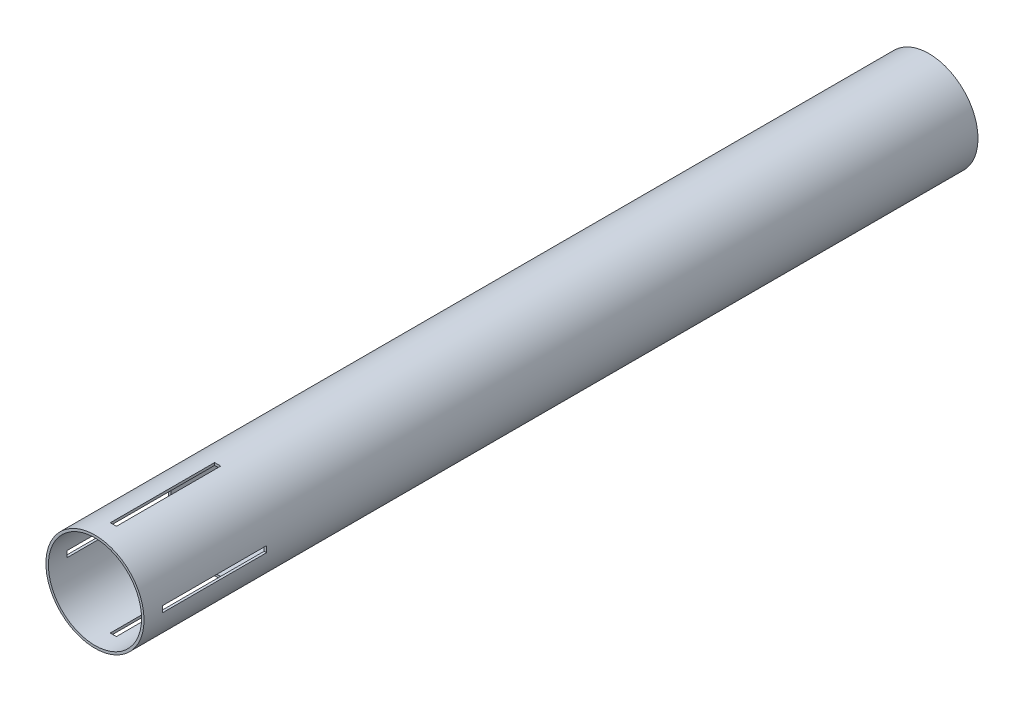
ISO-10303-21;
HEADER;
FILE_DESCRIPTION(('STEP AP214'),'2;1');
FILE_NAME('part.step','',(''),(''),'','','');
FILE_SCHEMA(('AUTOMOTIVE_DESIGN { 1 0 10303 214 1 1 1 1 }'));
ENDSEC;
DATA;
#1=APPLICATION_CONTEXT('core data for automotive mechanical design processes');
#2=APPLICATION_PROTOCOL_DEFINITION('international standard','automotive_design',2000,#1);
#3=PRODUCT_CONTEXT('',#1,'mechanical');
#4=PRODUCT('Part','Part','',(#3));
#5=PRODUCT_RELATED_PRODUCT_CATEGORY('part','',(#4));
#6=PRODUCT_DEFINITION_FORMATION('','',#4);
#7=PRODUCT_DEFINITION_CONTEXT('part definition',#1,'design');
#8=PRODUCT_DEFINITION('design','',#6,#7);
#9=PRODUCT_DEFINITION_SHAPE('','',#8);
#10=(LENGTH_UNIT() NAMED_UNIT(*) SI_UNIT(.MILLI.,.METRE.));
#11=(NAMED_UNIT(*) PLANE_ANGLE_UNIT() SI_UNIT($,.RADIAN.));
#12=(NAMED_UNIT(*) SI_UNIT($,.STERADIAN.) SOLID_ANGLE_UNIT());
#13=UNCERTAINTY_MEASURE_WITH_UNIT(LENGTH_MEASURE(1.E-05),#10,'distance_accuracy_value','');
#14=(GEOMETRIC_REPRESENTATION_CONTEXT(3) GLOBAL_UNCERTAINTY_ASSIGNED_CONTEXT((#13)) GLOBAL_UNIT_ASSIGNED_CONTEXT((#10,
#11,#12)) REPRESENTATION_CONTEXT('',''));
#15=CARTESIAN_POINT('',(0.,0.,0.));
#16=DIRECTION('',(0.,0.,1.));
#17=DIRECTION('',(1.,0.,0.));
#18=AXIS2_PLACEMENT_3D('',#15,#16,#17);
#19=CARTESIAN_POINT('',(-50.7006841669814,-3.175,736.6));
#20=DIRECTION('',(0.,-1.,0.));
#21=DIRECTION('',(0.,0.,-1.));
#22=AXIS2_PLACEMENT_3D('',#19,#20,#21);
#23=PLANE('',#22);
#24=DIRECTION('',(1.,0.,0.));
#25=VECTOR('',#24,1.);
#26=CARTESIAN_POINT('',(-50.7006841669814,-3.175,844.55));
#27=LINE('',#26,#25);
#28=CARTESIAN_POINT('',(-50.7006841669814,-3.175,844.55));
#29=VERTEX_POINT('',#28);
#30=CARTESIAN_POINT('',(-48.1554459537029,-3.175,844.55));
#31=VERTEX_POINT('',#30);
#32=EDGE_CURVE('E56',#29,#31,#27,.T.);
#33=ORIENTED_EDGE('',*,*,#32,.T.);
#34=DIRECTION('',(0.,0.,1.));
#35=VECTOR('',#34,1.);
#36=CARTESIAN_POINT('',(-48.1554459537029,-3.175,736.6));
#37=LINE('',#36,#35);
#38=CARTESIAN_POINT('',(-48.1554459537029,-3.175,736.6));
#39=VERTEX_POINT('',#38);
#40=EDGE_CURVE('E185',#39,#31,#37,.T.);
#41=ORIENTED_EDGE('',*,*,#40,.F.);
#42=DIRECTION('',(1.,0.,0.));
#43=VECTOR('',#42,1.);
#44=CARTESIAN_POINT('',(-50.7006841669814,-3.175,736.6));
#45=LINE('',#44,#43);
#46=CARTESIAN_POINT('',(-50.7006841669814,-3.175,736.6));
#47=VERTEX_POINT('',#46);
#48=EDGE_CURVE('E210',#47,#39,#45,.T.);
#49=ORIENTED_EDGE('',*,*,#48,.F.);
#50=DIRECTION('',(0.,0.,1.));
#51=VECTOR('',#50,1.);
#52=CARTESIAN_POINT('',(-50.7006841669814,-3.175,736.6));
#53=LINE('',#52,#51);
#54=EDGE_CURVE('E51',#47,#29,#53,.T.);
#55=ORIENTED_EDGE('',*,*,#54,.T.);
#56=EDGE_LOOP('',(#33,#41,#49,#55));
#57=FACE_BOUND('',#56,.T.);
#58=ADVANCED_FACE('F36',(#57),#23,.F.);
#59=CARTESIAN_POINT('',(-50.7006841669814,3.175,736.6));
#60=DIRECTION('',(0.,1.,0.));
#61=DIRECTION('',(0.,0.,1.));
#62=AXIS2_PLACEMENT_3D('',#59,#60,#61);
#63=PLANE('',#62);
#64=DIRECTION('',(-1.,0.,0.));
#65=VECTOR('',#64,1.);
#66=CARTESIAN_POINT('',(-48.1554459537029,3.175,844.55));
#67=LINE('',#66,#65);
#68=CARTESIAN_POINT('',(-48.1554459537029,3.175,844.55));
#69=VERTEX_POINT('',#68);
#70=CARTESIAN_POINT('',(-50.7006841669814,3.175,844.55));
#71=VERTEX_POINT('',#70);
#72=EDGE_CURVE('E280',#69,#71,#67,.T.);
#73=ORIENTED_EDGE('',*,*,#72,.T.);
#74=DIRECTION('',(0.,0.,1.));
#75=VECTOR('',#74,1.);
#76=CARTESIAN_POINT('',(-50.7006841669814,3.175,736.6));
#77=LINE('',#76,#75);
#78=CARTESIAN_POINT('',(-50.7006841669814,3.175,736.6));
#79=VERTEX_POINT('',#78);
#80=EDGE_CURVE('E215',#79,#71,#77,.T.);
#81=ORIENTED_EDGE('',*,*,#80,.F.);
#82=DIRECTION('',(-1.,0.,0.));
#83=VECTOR('',#82,1.);
#84=CARTESIAN_POINT('',(-50.7006841669814,3.175,736.6));
#85=LINE('',#84,#83);
#86=CARTESIAN_POINT('',(-48.1554459537029,3.175,736.6));
#87=VERTEX_POINT('',#86);
#88=EDGE_CURVE('E204',#87,#79,#85,.T.);
#89=ORIENTED_EDGE('',*,*,#88,.F.);
#90=DIRECTION('',(0.,0.,1.));
#91=VECTOR('',#90,1.);
#92=CARTESIAN_POINT('',(-48.1554459537029,3.175,736.6));
#93=LINE('',#92,#91);
#94=EDGE_CURVE('E212',#87,#69,#93,.T.);
#95=ORIENTED_EDGE('',*,*,#94,.T.);
#96=EDGE_LOOP('',(#73,#81,#89,#95));
#97=FACE_BOUND('',#96,.T.);
#98=ADVANCED_FACE('F295',(#97),#63,.F.);
#99=CARTESIAN_POINT('',(-3.17500000000001,-48.1554459537029,736.6));
#100=DIRECTION('',(-1.,0.,0.));
#101=DIRECTION('',(0.,-1.,0.));
#102=AXIS2_PLACEMENT_3D('',#99,#100,#101);
#103=PLANE('',#102);
#104=DIRECTION('',(0.,-1.,0.));
#105=VECTOR('',#104,1.);
#106=CARTESIAN_POINT('',(-3.17500000000001,-48.1554459537029,844.55));
#107=LINE('',#106,#105);
#108=CARTESIAN_POINT('',(-3.17500000000001,-48.1554459537029,844.55));
#109=VERTEX_POINT('',#108);
#110=CARTESIAN_POINT('',(-3.17500000000001,-50.7006841669814,844.55));
#111=VERTEX_POINT('',#110);
#112=EDGE_CURVE('E269',#109,#111,#107,.T.);
#113=ORIENTED_EDGE('',*,*,#112,.T.);
#114=DIRECTION('',(0.,0.,1.));
#115=VECTOR('',#114,1.);
#116=CARTESIAN_POINT('',(-3.17500000000001,-50.7006841669814,736.6));
#117=LINE('',#116,#115);
#118=CARTESIAN_POINT('',(-3.17500000000001,-50.7006841669814,736.6));
#119=VERTEX_POINT('',#118);
#120=EDGE_CURVE('E244',#119,#111,#117,.T.);
#121=ORIENTED_EDGE('',*,*,#120,.F.);
#122=DIRECTION('',(0.,-1.,0.));
#123=VECTOR('',#122,1.);
#124=CARTESIAN_POINT('',(-3.17500000000001,-48.1554459537029,736.6));
#125=LINE('',#124,#123);
#126=CARTESIAN_POINT('',(-3.17500000000001,-48.1554459537029,736.6));
#127=VERTEX_POINT('',#126);
#128=EDGE_CURVE('E166',#127,#119,#125,.T.);
#129=ORIENTED_EDGE('',*,*,#128,.F.);
#130=DIRECTION('',(0.,0.,1.));
#131=VECTOR('',#130,1.);
#132=CARTESIAN_POINT('',(-3.17500000000001,-48.1554459537029,736.6));
#133=LINE('',#132,#131);
#134=EDGE_CURVE('E176',#127,#109,#133,.T.);
#135=ORIENTED_EDGE('',*,*,#134,.T.);
#136=EDGE_LOOP('',(#113,#121,#129,#135));
#137=FACE_BOUND('',#136,.T.);
#138=ADVANCED_FACE('F305',(#137),#103,.F.);
#139=CARTESIAN_POINT('',(3.17500000000001,-48.1554459537029,736.6));
#140=DIRECTION('',(1.,0.,0.));
#141=DIRECTION('',(0.,1.,0.));
#142=AXIS2_PLACEMENT_3D('',#139,#140,#141);
#143=PLANE('',#142);
#144=DIRECTION('',(0.,1.,0.));
#145=VECTOR('',#144,1.);
#146=CARTESIAN_POINT('',(3.17500000000001,-50.7006841669814,844.55));
#147=LINE('',#146,#145);
#148=CARTESIAN_POINT('',(3.17500000000001,-50.7006841669814,844.55));
#149=VERTEX_POINT('',#148);
#150=CARTESIAN_POINT('',(3.175,-48.1554459537029,844.55));
#151=VERTEX_POINT('',#150);
#152=EDGE_CURVE('E274',#149,#151,#147,.T.);
#153=ORIENTED_EDGE('',*,*,#152,.T.);
#154=DIRECTION('',(0.,0.,1.));
#155=VECTOR('',#154,1.);
#156=CARTESIAN_POINT('',(3.175,-48.1554459537029,736.6));
#157=LINE('',#156,#155);
#158=CARTESIAN_POINT('',(3.175,-48.1554459537029,736.6));
#159=VERTEX_POINT('',#158);
#160=EDGE_CURVE('E156',#159,#151,#157,.T.);
#161=ORIENTED_EDGE('',*,*,#160,.F.);
#162=DIRECTION('',(0.,1.,0.));
#163=VECTOR('',#162,1.);
#164=CARTESIAN_POINT('',(3.17500000000001,-48.1554459537029,736.6));
#165=LINE('',#164,#163);
#166=CARTESIAN_POINT('',(3.17500000000001,-50.7006841669814,736.6));
#167=VERTEX_POINT('',#166);
#168=EDGE_CURVE('E149',#167,#159,#165,.T.);
#169=ORIENTED_EDGE('',*,*,#168,.F.);
#170=DIRECTION('',(0.,0.,1.));
#171=VECTOR('',#170,1.);
#172=CARTESIAN_POINT('',(3.17500000000001,-50.7006841669814,736.6));
#173=LINE('',#172,#171);
#174=EDGE_CURVE('E153',#167,#149,#173,.T.);
#175=ORIENTED_EDGE('',*,*,#174,.T.);
#176=EDGE_LOOP('',(#153,#161,#169,#175));
#177=FACE_BOUND('',#176,.T.);
#178=ADVANCED_FACE('F151',(#177),#143,.F.);
#179=CARTESIAN_POINT('',(48.1554459537029,-3.175,736.6));
#180=DIRECTION('',(0.,-1.,0.));
#181=DIRECTION('',(0.,0.,-1.));
#182=AXIS2_PLACEMENT_3D('',#179,#180,#181);
#183=PLANE('',#182);
#184=DIRECTION('',(1.,0.,0.));
#185=VECTOR('',#184,1.);
#186=CARTESIAN_POINT('',(48.1554459537029,-3.17500000000002,844.55));
#187=LINE('',#186,#185);
#188=CARTESIAN_POINT('',(48.1554459537029,-3.17500000000002,844.55));
#189=VERTEX_POINT('',#188);
#190=CARTESIAN_POINT('',(50.7006841669814,-3.175,844.55));
#191=VERTEX_POINT('',#190);
#192=EDGE_CURVE('E259',#189,#191,#187,.T.);
#193=ORIENTED_EDGE('',*,*,#192,.T.);
#194=DIRECTION('',(0.,0.,1.));
#195=VECTOR('',#194,1.);
#196=CARTESIAN_POINT('',(50.7006841669814,-3.175,736.6));
#197=LINE('',#196,#195);
#198=CARTESIAN_POINT('',(50.7006841669814,-3.175,736.6));
#199=VERTEX_POINT('',#198);
#200=EDGE_CURVE('E205',#199,#191,#197,.T.);
#201=ORIENTED_EDGE('',*,*,#200,.F.);
#202=DIRECTION('',(1.,0.,0.));
#203=VECTOR('',#202,1.);
#204=CARTESIAN_POINT('',(48.1554459537029,-3.175,736.6));
#205=LINE('',#204,#203);
#206=CARTESIAN_POINT('',(48.1554459537029,-3.17500000000002,736.6));
#207=VERTEX_POINT('',#206);
#208=EDGE_CURVE('E227',#207,#199,#205,.T.);
#209=ORIENTED_EDGE('',*,*,#208,.F.);
#210=DIRECTION('',(0.,0.,1.));
#211=VECTOR('',#210,1.);
#212=CARTESIAN_POINT('',(48.1554459537029,-3.17500000000002,736.6));
#213=LINE('',#212,#211);
#214=EDGE_CURVE('E233',#207,#189,#213,.T.);
#215=ORIENTED_EDGE('',*,*,#214,.T.);
#216=EDGE_LOOP('',(#193,#201,#209,#215));
#217=FACE_BOUND('',#216,.T.);
#218=ADVANCED_FACE('F314',(#217),#183,.F.);
#219=CARTESIAN_POINT('',(48.1554459537029,3.175,736.6));
#220=DIRECTION('',(0.,1.,0.));
#221=DIRECTION('',(0.,0.,1.));
#222=AXIS2_PLACEMENT_3D('',#219,#220,#221);
#223=PLANE('',#222);
#224=DIRECTION('',(-1.,0.,0.));
#225=VECTOR('',#224,1.);
#226=CARTESIAN_POINT('',(50.7006841669814,3.175,844.55));
#227=LINE('',#226,#225);
#228=CARTESIAN_POINT('',(50.7006841669814,3.175,844.55));
#229=VERTEX_POINT('',#228);
#230=CARTESIAN_POINT('',(48.1554459537029,3.175,844.55));
#231=VERTEX_POINT('',#230);
#232=EDGE_CURVE('E264',#229,#231,#227,.T.);
#233=ORIENTED_EDGE('',*,*,#232,.T.);
#234=DIRECTION('',(0.,0.,1.));
#235=VECTOR('',#234,1.);
#236=CARTESIAN_POINT('',(48.1554459537029,3.175,736.6));
#237=LINE('',#236,#235);
#238=CARTESIAN_POINT('',(48.1554459537029,3.175,736.6));
#239=VERTEX_POINT('',#238);
#240=EDGE_CURVE('E235',#239,#231,#237,.T.);
#241=ORIENTED_EDGE('',*,*,#240,.F.);
#242=DIRECTION('',(-1.,0.,0.));
#243=VECTOR('',#242,1.);
#244=CARTESIAN_POINT('',(48.1554459537029,3.175,736.6));
#245=LINE('',#244,#243);
#246=CARTESIAN_POINT('',(50.7006841669814,3.175,736.6));
#247=VERTEX_POINT('',#246);
#248=EDGE_CURVE('E222',#247,#239,#245,.T.);
#249=ORIENTED_EDGE('',*,*,#248,.F.);
#250=DIRECTION('',(0.,0.,1.));
#251=VECTOR('',#250,1.);
#252=CARTESIAN_POINT('',(50.7006841669814,3.175,736.6));
#253=LINE('',#252,#251);
#254=EDGE_CURVE('E230',#247,#229,#253,.T.);
#255=ORIENTED_EDGE('',*,*,#254,.T.);
#256=EDGE_LOOP('',(#233,#241,#249,#255));
#257=FACE_BOUND('',#256,.T.);
#258=ADVANCED_FACE('F317',(#257),#223,.F.);
#259=CARTESIAN_POINT('',(3.175,50.7006841669814,736.6));
#260=DIRECTION('',(1.,0.,0.));
#261=DIRECTION('',(0.,1.,0.));
#262=AXIS2_PLACEMENT_3D('',#259,#260,#261);
#263=PLANE('',#262);
#264=DIRECTION('',(0.,1.,0.));
#265=VECTOR('',#264,1.);
#266=CARTESIAN_POINT('',(3.175,48.1554459537029,844.55));
#267=LINE('',#266,#265);
#268=CARTESIAN_POINT('',(3.175,48.1554459537029,844.55));
#269=VERTEX_POINT('',#268);
#270=CARTESIAN_POINT('',(3.175,50.7006841669814,844.55));
#271=VERTEX_POINT('',#270);
#272=EDGE_CURVE('E223',#269,#271,#267,.T.);
#273=ORIENTED_EDGE('',*,*,#272,.T.);
#274=DIRECTION('',(0.,0.,1.));
#275=VECTOR('',#274,1.);
#276=CARTESIAN_POINT('',(3.175,50.7006841669814,736.6));
#277=LINE('',#276,#275);
#278=CARTESIAN_POINT('',(3.175,50.7006841669814,736.6));
#279=VERTEX_POINT('',#278);
#280=EDGE_CURVE('E169',#279,#271,#277,.T.);
#281=ORIENTED_EDGE('',*,*,#280,.F.);
#282=DIRECTION('',(0.,1.,0.));
#283=VECTOR('',#282,1.);
#284=CARTESIAN_POINT('',(3.175,50.7006841669814,736.6));
#285=LINE('',#284,#283);
#286=CARTESIAN_POINT('',(3.175,48.1554459537029,736.6));
#287=VERTEX_POINT('',#286);
#288=EDGE_CURVE('E189',#287,#279,#285,.T.);
#289=ORIENTED_EDGE('',*,*,#288,.F.);
#290=DIRECTION('',(0.,0.,1.));
#291=VECTOR('',#290,1.);
#292=CARTESIAN_POINT('',(3.175,48.1554459537029,736.6));
#293=LINE('',#292,#291);
#294=EDGE_CURVE('E195',#287,#269,#293,.T.);
#295=ORIENTED_EDGE('',*,*,#294,.T.);
#296=EDGE_LOOP('',(#273,#281,#289,#295));
#297=FACE_BOUND('',#296,.T.);
#298=ADVANCED_FACE('F321',(#297),#263,.F.);
#299=CARTESIAN_POINT('',(-3.175,50.7006841669814,736.6));
#300=DIRECTION('',(-1.,0.,0.));
#301=DIRECTION('',(0.,-1.,0.));
#302=AXIS2_PLACEMENT_3D('',#299,#300,#301);
#303=PLANE('',#302);
#304=DIRECTION('',(0.,-1.,0.));
#305=VECTOR('',#304,1.);
#306=CARTESIAN_POINT('',(-3.175,50.7006841669814,844.55));
#307=LINE('',#306,#305);
#308=CARTESIAN_POINT('',(-3.175,50.7006841669814,844.55));
#309=VERTEX_POINT('',#308);
#310=CARTESIAN_POINT('',(-3.175,48.1554459537029,844.55));
#311=VERTEX_POINT('',#310);
#312=EDGE_CURVE('E254',#309,#311,#307,.T.);
#313=ORIENTED_EDGE('',*,*,#312,.T.);
#314=DIRECTION('',(0.,0.,1.));
#315=VECTOR('',#314,1.);
#316=CARTESIAN_POINT('',(-3.175,48.1554459537029,736.6));
#317=LINE('',#316,#315);
#318=CARTESIAN_POINT('',(-3.175,48.1554459537029,736.6));
#319=VERTEX_POINT('',#318);
#320=EDGE_CURVE('E197',#319,#311,#317,.T.);
#321=ORIENTED_EDGE('',*,*,#320,.F.);
#322=DIRECTION('',(0.,-1.,0.));
#323=VECTOR('',#322,1.);
#324=CARTESIAN_POINT('',(-3.175,50.7006841669814,736.6));
#325=LINE('',#324,#323);
#326=CARTESIAN_POINT('',(-3.175,50.7006841669814,736.6));
#327=VERTEX_POINT('',#326);
#328=EDGE_CURVE('E184',#327,#319,#325,.T.);
#329=ORIENTED_EDGE('',*,*,#328,.F.);
#330=DIRECTION('',(0.,0.,1.));
#331=VECTOR('',#330,1.);
#332=CARTESIAN_POINT('',(-3.175,50.7006841669814,736.6));
#333=LINE('',#332,#331);
#334=EDGE_CURVE('E192',#327,#309,#333,.T.);
#335=ORIENTED_EDGE('',*,*,#334,.T.);
#336=EDGE_LOOP('',(#313,#321,#329,#335));
#337=FACE_BOUND('',#336,.T.);
#338=ADVANCED_FACE('F329',(#337),#303,.F.);
#339=CARTESIAN_POINT('',(0.,0.,863.6));
#340=DIRECTION('',(0.,0.,1.));
#341=DIRECTION('',(1.,0.,0.));
#342=AXIS2_PLACEMENT_3D('',#339,#340,#341);
#343=PLANE('',#342);
#344=CARTESIAN_POINT('',(0.,0.,863.6));
#345=DIRECTION('',(0.,0.,1.));
#346=DIRECTION('',(1.,0.,0.));
#347=AXIS2_PLACEMENT_3D('',#344,#345,#346);
#348=CIRCLE('',#347,48.26);
#349=CARTESIAN_POINT('',(48.26,0.,863.6));
#350=VERTEX_POINT('',#349);
#351=EDGE_CURVE('E239',#350,#350,#348,.T.);
#352=ORIENTED_EDGE('',*,*,#351,.F.);
#353=EDGE_LOOP('',(#352));
#354=FACE_BOUND('',#353,.T.);
#355=CARTESIAN_POINT('',(0.,0.,863.6));
#356=DIRECTION('',(0.,0.,1.));
#357=DIRECTION('',(1.,0.,0.));
#358=AXIS2_PLACEMENT_3D('',#355,#356,#357);
#359=CIRCLE('',#358,50.8);
#360=CARTESIAN_POINT('',(50.8,0.,863.6));
#361=VERTEX_POINT('',#360);
#362=EDGE_CURVE('E11',#361,#361,#359,.T.);
#363=ORIENTED_EDGE('',*,*,#362,.T.);
#364=EDGE_LOOP('',(#363));
#365=FACE_BOUND('',#364,.T.);
#366=ADVANCED_FACE('F326',(#354,#365),#343,.T.);
#367=CARTESIAN_POINT('',(0.,0.,0.));
#368=DIRECTION('',(0.,0.,1.));
#369=DIRECTION('',(1.,0.,0.));
#370=AXIS2_PLACEMENT_3D('',#367,#368,#369);
#371=PLANE('',#370);
#372=CARTESIAN_POINT('',(0.,0.,0.));
#373=DIRECTION('',(0.,0.,1.));
#374=DIRECTION('',(1.,0.,0.));
#375=AXIS2_PLACEMENT_3D('',#372,#373,#374);
#376=CIRCLE('',#375,50.8);
#377=CARTESIAN_POINT('',(50.8,0.,0.));
#378=VERTEX_POINT('',#377);
#379=EDGE_CURVE('E40',#378,#378,#376,.T.);
#380=ORIENTED_EDGE('',*,*,#379,.F.);
#381=EDGE_LOOP('',(#380));
#382=FACE_BOUND('',#381,.T.);
#383=CARTESIAN_POINT('',(0.,0.,0.));
#384=DIRECTION('',(0.,0.,1.));
#385=DIRECTION('',(1.,0.,0.));
#386=AXIS2_PLACEMENT_3D('',#383,#384,#385);
#387=CIRCLE('',#386,48.26);
#388=CARTESIAN_POINT('',(48.26,0.,0.));
#389=VERTEX_POINT('',#388);
#390=EDGE_CURVE('E242',#389,#389,#387,.T.);
#391=ORIENTED_EDGE('',*,*,#390,.T.);
#392=EDGE_LOOP('',(#391));
#393=FACE_BOUND('',#392,.T.);
#394=ADVANCED_FACE('F328',(#382,#393),#371,.F.);
#395=CARTESIAN_POINT('',(0.,0.,863.6));
#396=DIRECTION('',(0.,0.,-1.));
#397=DIRECTION('',(-1.,0.,0.));
#398=AXIS2_PLACEMENT_3D('',#395,#396,#397);
#399=CYLINDRICAL_SURFACE('',#398,50.8);
#400=ORIENTED_EDGE('',*,*,#362,.F.);
#401=EDGE_LOOP('',(#400));
#402=FACE_BOUND('',#401,.T.);
#403=CARTESIAN_POINT('',(0.,0.,844.55));
#404=DIRECTION('',(0.,0.,1.));
#405=DIRECTION('',(1.,0.,0.));
#406=AXIS2_PLACEMENT_3D('',#403,#404,#405);
#407=CIRCLE('',#406,50.8);
#408=EDGE_CURVE('E278',#71,#29,#407,.T.);
#409=ORIENTED_EDGE('',*,*,#408,.T.);
#410=ORIENTED_EDGE('',*,*,#54,.F.);
#411=CARTESIAN_POINT('',(0.,0.,736.6));
#412=DIRECTION('',(0.,0.,1.));
#413=DIRECTION('',(1.,0.,0.));
#414=AXIS2_PLACEMENT_3D('',#411,#412,#413);
#415=CIRCLE('',#414,50.8);
#416=EDGE_CURVE('E208',#79,#47,#415,.T.);
#417=ORIENTED_EDGE('',*,*,#416,.F.);
#418=ORIENTED_EDGE('',*,*,#80,.T.);
#419=EDGE_LOOP('',(#409,#410,#417,#418));
#420=FACE_BOUND('',#419,.T.);
#421=ORIENTED_EDGE('',*,*,#120,.T.);
#422=CARTESIAN_POINT('',(0.,0.,844.55));
#423=DIRECTION('',(0.,0.,1.));
#424=DIRECTION('',(1.,0.,0.));
#425=AXIS2_PLACEMENT_3D('',#422,#423,#424);
#426=CIRCLE('',#425,50.8);
#427=EDGE_CURVE('E174',#111,#149,#426,.T.);
#428=ORIENTED_EDGE('',*,*,#427,.T.);
#429=ORIENTED_EDGE('',*,*,#174,.F.);
#430=CARTESIAN_POINT('',(0.,0.,736.6));
#431=DIRECTION('',(0.,0.,1.));
#432=DIRECTION('',(1.,0.,0.));
#433=AXIS2_PLACEMENT_3D('',#430,#431,#432);
#434=CIRCLE('',#433,50.8);
#435=EDGE_CURVE('E160',#119,#167,#434,.T.);
#436=ORIENTED_EDGE('',*,*,#435,.F.);
#437=EDGE_LOOP('',(#421,#428,#429,#436));
#438=FACE_BOUND('',#437,.T.);
#439=ORIENTED_EDGE('',*,*,#200,.T.);
#440=CARTESIAN_POINT('',(0.,0.,844.55));
#441=DIRECTION('',(0.,0.,1.));
#442=DIRECTION('',(1.,0.,0.));
#443=AXIS2_PLACEMENT_3D('',#440,#441,#442);
#444=CIRCLE('',#443,50.8);
#445=EDGE_CURVE('E266',#191,#229,#444,.T.);
#446=ORIENTED_EDGE('',*,*,#445,.T.);
#447=ORIENTED_EDGE('',*,*,#254,.F.);
#448=CARTESIAN_POINT('',(0.,0.,736.6));
#449=DIRECTION('',(0.,0.,1.));
#450=DIRECTION('',(1.,0.,0.));
#451=AXIS2_PLACEMENT_3D('',#448,#449,#450);
#452=CIRCLE('',#451,50.8);
#453=EDGE_CURVE('E219',#199,#247,#452,.T.);
#454=ORIENTED_EDGE('',*,*,#453,.F.);
#455=EDGE_LOOP('',(#439,#446,#447,#454));
#456=FACE_BOUND('',#455,.T.);
#457=ORIENTED_EDGE('',*,*,#280,.T.);
#458=CARTESIAN_POINT('',(0.,0.,844.55));
#459=DIRECTION('',(0.,0.,1.));
#460=DIRECTION('',(1.,0.,0.));
#461=AXIS2_PLACEMENT_3D('',#458,#459,#460);
#462=CIRCLE('',#461,50.8);
#463=EDGE_CURVE('E256',#271,#309,#462,.T.);
#464=ORIENTED_EDGE('',*,*,#463,.T.);
#465=ORIENTED_EDGE('',*,*,#334,.F.);
#466=CARTESIAN_POINT('',(0.,0.,736.6));
#467=DIRECTION('',(0.,0.,1.));
#468=DIRECTION('',(1.,0.,0.));
#469=AXIS2_PLACEMENT_3D('',#466,#467,#468);
#470=CIRCLE('',#469,50.8);
#471=EDGE_CURVE('E181',#279,#327,#470,.T.);
#472=ORIENTED_EDGE('',*,*,#471,.F.);
#473=EDGE_LOOP('',(#457,#464,#465,#472));
#474=FACE_BOUND('',#473,.T.);
#475=ORIENTED_EDGE('',*,*,#379,.T.);
#476=EDGE_LOOP('',(#475));
#477=FACE_BOUND('',#476,.T.);
#478=ADVANCED_FACE('F38',(#402,#420,#438,#456,#474,#477),#399,.T.);
#479=CARTESIAN_POINT('',(0.,0.,863.6));
#480=DIRECTION('',(0.,0.,-1.));
#481=DIRECTION('',(-1.,0.,0.));
#482=AXIS2_PLACEMENT_3D('',#479,#480,#481);
#483=CYLINDRICAL_SURFACE('',#482,48.26);
#484=ORIENTED_EDGE('',*,*,#351,.T.);
#485=EDGE_LOOP('',(#484));
#486=FACE_BOUND('',#485,.T.);
#487=ORIENTED_EDGE('',*,*,#40,.T.);
#488=CARTESIAN_POINT('',(0.,0.,844.55));
#489=DIRECTION('',(0.,0.,-1.));
#490=DIRECTION('',(1.,0.,0.));
#491=AXIS2_PLACEMENT_3D('',#488,#489,#490);
#492=CIRCLE('',#491,48.26);
#493=EDGE_CURVE('E282',#31,#69,#492,.T.);
#494=ORIENTED_EDGE('',*,*,#493,.T.);
#495=ORIENTED_EDGE('',*,*,#94,.F.);
#496=CARTESIAN_POINT('',(0.,0.,736.6));
#497=DIRECTION('',(0.,0.,-1.));
#498=DIRECTION('',(1.,0.,0.));
#499=AXIS2_PLACEMENT_3D('',#496,#497,#498);
#500=CIRCLE('',#499,48.26);
#501=EDGE_CURVE('E201',#39,#87,#500,.T.);
#502=ORIENTED_EDGE('',*,*,#501,.F.);
#503=EDGE_LOOP('',(#487,#494,#495,#502));
#504=FACE_BOUND('',#503,.T.);
#505=ORIENTED_EDGE('',*,*,#160,.T.);
#506=CARTESIAN_POINT('',(0.,0.,844.55));
#507=DIRECTION('',(0.,0.,-1.));
#508=DIRECTION('',(1.,0.,0.));
#509=AXIS2_PLACEMENT_3D('',#506,#507,#508);
#510=CIRCLE('',#509,48.26);
#511=EDGE_CURVE('E271',#151,#109,#510,.T.);
#512=ORIENTED_EDGE('',*,*,#511,.T.);
#513=ORIENTED_EDGE('',*,*,#134,.F.);
#514=CARTESIAN_POINT('',(0.,0.,736.6));
#515=DIRECTION('',(0.,0.,-1.));
#516=DIRECTION('',(1.,0.,0.));
#517=AXIS2_PLACEMENT_3D('',#514,#515,#516);
#518=CIRCLE('',#517,48.26);
#519=EDGE_CURVE('E159',#159,#127,#518,.T.);
#520=ORIENTED_EDGE('',*,*,#519,.F.);
#521=EDGE_LOOP('',(#505,#512,#513,#520));
#522=FACE_BOUND('',#521,.T.);
#523=CARTESIAN_POINT('',(0.,0.,844.55));
#524=DIRECTION('',(0.,0.,-1.));
#525=DIRECTION('',(1.,0.,0.));
#526=AXIS2_PLACEMENT_3D('',#523,#524,#525);
#527=CIRCLE('',#526,48.26);
#528=EDGE_CURVE('E261',#231,#189,#527,.T.);
#529=ORIENTED_EDGE('',*,*,#528,.T.);
#530=ORIENTED_EDGE('',*,*,#214,.F.);
#531=CARTESIAN_POINT('',(0.,0.,736.6));
#532=DIRECTION('',(0.,0.,-1.));
#533=DIRECTION('',(1.,0.,0.));
#534=AXIS2_PLACEMENT_3D('',#531,#532,#533);
#535=CIRCLE('',#534,48.26);
#536=EDGE_CURVE('E225',#239,#207,#535,.T.);
#537=ORIENTED_EDGE('',*,*,#536,.F.);
#538=ORIENTED_EDGE('',*,*,#240,.T.);
#539=EDGE_LOOP('',(#529,#530,#537,#538));
#540=FACE_BOUND('',#539,.T.);
#541=CARTESIAN_POINT('',(0.,0.,844.55));
#542=DIRECTION('',(0.,0.,-1.));
#543=DIRECTION('',(1.,0.,0.));
#544=AXIS2_PLACEMENT_3D('',#541,#542,#543);
#545=CIRCLE('',#544,48.26);
#546=EDGE_CURVE('E251',#311,#269,#545,.T.);
#547=ORIENTED_EDGE('',*,*,#546,.T.);
#548=ORIENTED_EDGE('',*,*,#294,.F.);
#549=CARTESIAN_POINT('',(0.,0.,736.6));
#550=DIRECTION('',(0.,0.,-1.));
#551=DIRECTION('',(1.,0.,0.));
#552=AXIS2_PLACEMENT_3D('',#549,#550,#551);
#553=CIRCLE('',#552,48.26);
#554=EDGE_CURVE('E187',#319,#287,#553,.T.);
#555=ORIENTED_EDGE('',*,*,#554,.F.);
#556=ORIENTED_EDGE('',*,*,#320,.T.);
#557=EDGE_LOOP('',(#547,#548,#555,#556));
#558=FACE_BOUND('',#557,.T.);
#559=ORIENTED_EDGE('',*,*,#390,.F.);
#560=EDGE_LOOP('',(#559));
#561=FACE_BOUND('',#560,.T.);
#562=ADVANCED_FACE('F287',(#486,#504,#522,#540,#558,#561),#483,.F.);
#563=CARTESIAN_POINT('',(0.,0.,736.6));
#564=DIRECTION('',(0.,0.,1.));
#565=DIRECTION('',(1.,0.,0.));
#566=AXIS2_PLACEMENT_3D('',#563,#564,#565);
#567=PLANE('',#566);
#568=ORIENTED_EDGE('',*,*,#453,.T.);
#569=ORIENTED_EDGE('',*,*,#248,.T.);
#570=ORIENTED_EDGE('',*,*,#536,.T.);
#571=ORIENTED_EDGE('',*,*,#208,.T.);
#572=EDGE_LOOP('',(#568,#569,#570,#571));
#573=FACE_BOUND('',#572,.T.);
#574=ADVANCED_FACE('F310',(#573),#567,.T.);
#575=CARTESIAN_POINT('',(0.,0.,736.6));
#576=DIRECTION('',(0.,0.,1.));
#577=DIRECTION('',(1.,0.,0.));
#578=AXIS2_PLACEMENT_3D('',#575,#576,#577);
#579=PLANE('',#578);
#580=ORIENTED_EDGE('',*,*,#501,.T.);
#581=ORIENTED_EDGE('',*,*,#88,.T.);
#582=ORIENTED_EDGE('',*,*,#416,.T.);
#583=ORIENTED_EDGE('',*,*,#48,.T.);
#584=EDGE_LOOP('',(#580,#581,#582,#583));
#585=FACE_BOUND('',#584,.T.);
#586=ADVANCED_FACE('F299',(#585),#579,.T.);
#587=CARTESIAN_POINT('',(0.,0.,736.6));
#588=DIRECTION('',(0.,0.,1.));
#589=DIRECTION('',(1.,0.,0.));
#590=AXIS2_PLACEMENT_3D('',#587,#588,#589);
#591=PLANE('',#590);
#592=ORIENTED_EDGE('',*,*,#471,.T.);
#593=ORIENTED_EDGE('',*,*,#328,.T.);
#594=ORIENTED_EDGE('',*,*,#554,.T.);
#595=ORIENTED_EDGE('',*,*,#288,.T.);
#596=EDGE_LOOP('',(#592,#593,#594,#595));
#597=FACE_BOUND('',#596,.T.);
#598=ADVANCED_FACE('F360',(#597),#591,.T.);
#599=CARTESIAN_POINT('',(0.,0.,736.6));
#600=DIRECTION('',(0.,0.,1.));
#601=DIRECTION('',(1.,0.,0.));
#602=AXIS2_PLACEMENT_3D('',#599,#600,#601);
#603=PLANE('',#602);
#604=ORIENTED_EDGE('',*,*,#435,.T.);
#605=ORIENTED_EDGE('',*,*,#168,.T.);
#606=ORIENTED_EDGE('',*,*,#519,.T.);
#607=ORIENTED_EDGE('',*,*,#128,.T.);
#608=EDGE_LOOP('',(#604,#605,#606,#607));
#609=FACE_BOUND('',#608,.T.);
#610=ADVANCED_FACE('F164',(#609),#603,.T.);
#611=CARTESIAN_POINT('',(0.,0.,844.55));
#612=DIRECTION('',(0.,0.,1.));
#613=DIRECTION('',(1.,0.,0.));
#614=AXIS2_PLACEMENT_3D('',#611,#612,#613);
#615=PLANE('',#614);
#616=ORIENTED_EDGE('',*,*,#463,.F.);
#617=ORIENTED_EDGE('',*,*,#272,.F.);
#618=ORIENTED_EDGE('',*,*,#546,.F.);
#619=ORIENTED_EDGE('',*,*,#312,.F.);
#620=EDGE_LOOP('',(#616,#617,#618,#619));
#621=FACE_BOUND('',#620,.T.);
#622=ADVANCED_FACE('F373',(#621),#615,.F.);
#623=CARTESIAN_POINT('',(0.,0.,844.55));
#624=DIRECTION('',(0.,0.,1.));
#625=DIRECTION('',(1.,0.,0.));
#626=AXIS2_PLACEMENT_3D('',#623,#624,#625);
#627=PLANE('',#626);
#628=ORIENTED_EDGE('',*,*,#445,.F.);
#629=ORIENTED_EDGE('',*,*,#192,.F.);
#630=ORIENTED_EDGE('',*,*,#528,.F.);
#631=ORIENTED_EDGE('',*,*,#232,.F.);
#632=EDGE_LOOP('',(#628,#629,#630,#631));
#633=FACE_BOUND('',#632,.T.);
#634=ADVANCED_FACE('F379',(#633),#627,.F.);
#635=CARTESIAN_POINT('',(0.,0.,844.55));
#636=DIRECTION('',(0.,0.,1.));
#637=DIRECTION('',(1.,0.,0.));
#638=AXIS2_PLACEMENT_3D('',#635,#636,#637);
#639=PLANE('',#638);
#640=ORIENTED_EDGE('',*,*,#427,.F.);
#641=ORIENTED_EDGE('',*,*,#112,.F.);
#642=ORIENTED_EDGE('',*,*,#511,.F.);
#643=ORIENTED_EDGE('',*,*,#152,.F.);
#644=EDGE_LOOP('',(#640,#641,#642,#643));
#645=FACE_BOUND('',#644,.T.);
#646=ADVANCED_FACE('F387',(#645),#639,.F.);
#647=CARTESIAN_POINT('',(0.,0.,844.55));
#648=DIRECTION('',(0.,0.,1.));
#649=DIRECTION('',(1.,0.,0.));
#650=AXIS2_PLACEMENT_3D('',#647,#648,#649);
#651=PLANE('',#650);
#652=ORIENTED_EDGE('',*,*,#493,.F.);
#653=ORIENTED_EDGE('',*,*,#32,.F.);
#654=ORIENTED_EDGE('',*,*,#408,.F.);
#655=ORIENTED_EDGE('',*,*,#72,.F.);
#656=EDGE_LOOP('',(#652,#653,#654,#655));
#657=FACE_BOUND('',#656,.T.);
#658=ADVANCED_FACE('F292',(#657),#651,.F.);
#659=CLOSED_SHELL('',(#58,#98,#138,#178,#218,#258,#298,#338,#366,#394,#478,#562,#574,#586,#598,
#610,#622,#634,#646,#658));
#660=MANIFOLD_SOLID_BREP('B2',#659);
#661=ADVANCED_BREP_SHAPE_REPRESENTATION('',(#18,#660),#14);
#662=SHAPE_DEFINITION_REPRESENTATION(#9,#661);
ENDSEC;
END-ISO-10303-21;
